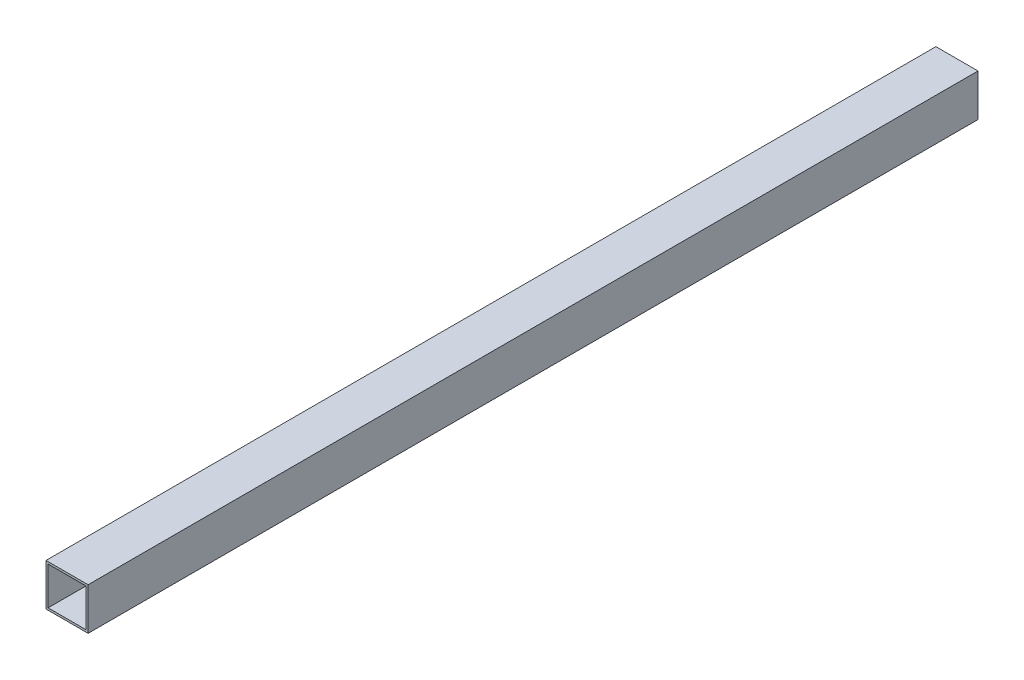
ISO-10303-21;
HEADER;
FILE_DESCRIPTION(('STEP AP214'),'2;1');
FILE_NAME('part.step','',(''),(''),'','','');
FILE_SCHEMA(('AUTOMOTIVE_DESIGN { 1 0 10303 214 1 1 1 1 }'));
ENDSEC;
DATA;
#1=APPLICATION_CONTEXT('core data for automotive mechanical design processes');
#2=APPLICATION_PROTOCOL_DEFINITION('international standard','automotive_design',2000,#1);
#3=PRODUCT_CONTEXT('',#1,'mechanical');
#4=PRODUCT('Part','Part','',(#3));
#5=PRODUCT_RELATED_PRODUCT_CATEGORY('part','',(#4));
#6=PRODUCT_DEFINITION_FORMATION('','',#4);
#7=PRODUCT_DEFINITION_CONTEXT('part definition',#1,'design');
#8=PRODUCT_DEFINITION('design','',#6,#7);
#9=PRODUCT_DEFINITION_SHAPE('','',#8);
#10=(LENGTH_UNIT() NAMED_UNIT(*) SI_UNIT(.MILLI.,.METRE.));
#11=(NAMED_UNIT(*) PLANE_ANGLE_UNIT() SI_UNIT($,.RADIAN.));
#12=(NAMED_UNIT(*) SI_UNIT($,.STERADIAN.) SOLID_ANGLE_UNIT());
#13=UNCERTAINTY_MEASURE_WITH_UNIT(LENGTH_MEASURE(1.E-05),#10,'distance_accuracy_value','');
#14=(GEOMETRIC_REPRESENTATION_CONTEXT(3) GLOBAL_UNCERTAINTY_ASSIGNED_CONTEXT((#13)) GLOBAL_UNIT_ASSIGNED_CONTEXT((#10,
#11,#12)) REPRESENTATION_CONTEXT('',''));
#15=CARTESIAN_POINT('',(0.,0.,0.));
#16=DIRECTION('',(0.,0.,1.));
#17=DIRECTION('',(1.,0.,0.));
#18=AXIS2_PLACEMENT_3D('',#15,#16,#17);
#19=CARTESIAN_POINT('',(0.,0.,422.68));
#20=DIRECTION('',(0.,0.,1.));
#21=DIRECTION('',(1.,0.,0.));
#22=AXIS2_PLACEMENT_3D('',#19,#20,#21);
#23=PLANE('',#22);
#24=DIRECTION('',(0.,-1.,0.));
#25=VECTOR('',#24,1.);
#26=CARTESIAN_POINT('',(0.,0.,422.68));
#27=LINE('',#26,#25);
#28=CARTESIAN_POINT('',(0.,0.,422.68));
#29=VERTEX_POINT('',#28);
#30=CARTESIAN_POINT('',(0.,-20.,422.68));
#31=VERTEX_POINT('',#30);
#32=EDGE_CURVE('E134',#29,#31,#27,.T.);
#33=ORIENTED_EDGE('',*,*,#32,.T.);
#34=DIRECTION('',(1.,0.,0.));
#35=VECTOR('',#34,1.);
#36=CARTESIAN_POINT('',(0.,-20.,422.68));
#37=LINE('',#36,#35);
#38=CARTESIAN_POINT('',(20.,-20.,422.68));
#39=VERTEX_POINT('',#38);
#40=EDGE_CURVE('E137',#31,#39,#37,.T.);
#41=ORIENTED_EDGE('',*,*,#40,.T.);
#42=DIRECTION('',(0.,1.,0.));
#43=VECTOR('',#42,1.);
#44=CARTESIAN_POINT('',(20.,0.,422.68));
#45=LINE('',#44,#43);
#46=CARTESIAN_POINT('',(20.,0.,422.68));
#47=VERTEX_POINT('',#46);
#48=EDGE_CURVE('E140',#39,#47,#45,.T.);
#49=ORIENTED_EDGE('',*,*,#48,.T.);
#50=DIRECTION('',(-1.,0.,0.));
#51=VECTOR('',#50,1.);
#52=CARTESIAN_POINT('',(0.,0.,422.68));
#53=LINE('',#52,#51);
#54=EDGE_CURVE('E142',#47,#29,#53,.T.);
#55=ORIENTED_EDGE('',*,*,#54,.T.);
#56=EDGE_LOOP('',(#33,#41,#49,#55));
#57=FACE_BOUND('',#56,.T.);
#58=DIRECTION('',(-1.,0.,0.));
#59=VECTOR('',#58,1.);
#60=CARTESIAN_POINT('',(1.,-1.,422.68));
#61=LINE('',#60,#59);
#62=CARTESIAN_POINT('',(19.,-1.,422.68));
#63=VERTEX_POINT('',#62);
#64=CARTESIAN_POINT('',(1.,-1.,422.68));
#65=VERTEX_POINT('',#64);
#66=EDGE_CURVE('E106',#63,#65,#61,.T.);
#67=ORIENTED_EDGE('',*,*,#66,.F.);
#68=DIRECTION('',(0.,1.,0.));
#69=VECTOR('',#68,1.);
#70=CARTESIAN_POINT('',(19.,-19.,422.68));
#71=LINE('',#70,#69);
#72=CARTESIAN_POINT('',(19.,-19.,422.68));
#73=VERTEX_POINT('',#72);
#74=EDGE_CURVE('E98',#73,#63,#71,.T.);
#75=ORIENTED_EDGE('',*,*,#74,.F.);
#76=DIRECTION('',(1.,0.,0.));
#77=VECTOR('',#76,1.);
#78=CARTESIAN_POINT('',(1.,-19.,422.68));
#79=LINE('',#78,#77);
#80=CARTESIAN_POINT('',(1.,-19.,422.68));
#81=VERTEX_POINT('',#80);
#82=EDGE_CURVE('E120',#81,#73,#79,.T.);
#83=ORIENTED_EDGE('',*,*,#82,.F.);
#84=DIRECTION('',(0.,-1.,0.));
#85=VECTOR('',#84,1.);
#86=CARTESIAN_POINT('',(1.,-19.,422.68));
#87=LINE('',#86,#85);
#88=EDGE_CURVE('E118',#65,#81,#87,.T.);
#89=ORIENTED_EDGE('',*,*,#88,.F.);
#90=EDGE_LOOP('',(#67,#75,#83,#89));
#91=FACE_BOUND('',#90,.T.);
#92=ADVANCED_FACE('F33',(#57,#91),#23,.T.);
#93=CARTESIAN_POINT('',(0.,0.,0.));
#94=DIRECTION('',(0.,0.,1.));
#95=DIRECTION('',(1.,0.,0.));
#96=AXIS2_PLACEMENT_3D('',#93,#94,#95);
#97=PLANE('',#96);
#98=DIRECTION('',(0.,-1.,0.));
#99=VECTOR('',#98,1.);
#100=CARTESIAN_POINT('',(0.,0.,0.));
#101=LINE('',#100,#99);
#102=CARTESIAN_POINT('',(0.,0.,0.));
#103=VERTEX_POINT('',#102);
#104=CARTESIAN_POINT('',(0.,-20.,0.));
#105=VERTEX_POINT('',#104);
#106=EDGE_CURVE('E114',#103,#105,#101,.T.);
#107=ORIENTED_EDGE('',*,*,#106,.F.);
#108=DIRECTION('',(-1.,0.,0.));
#109=VECTOR('',#108,1.);
#110=CARTESIAN_POINT('',(0.,0.,0.));
#111=LINE('',#110,#109);
#112=CARTESIAN_POINT('',(20.,0.,0.));
#113=VERTEX_POINT('',#112);
#114=EDGE_CURVE('E138',#113,#103,#111,.T.);
#115=ORIENTED_EDGE('',*,*,#114,.F.);
#116=DIRECTION('',(0.,1.,0.));
#117=VECTOR('',#116,1.);
#118=CARTESIAN_POINT('',(20.,0.,0.));
#119=LINE('',#118,#117);
#120=CARTESIAN_POINT('',(20.,-20.,0.));
#121=VERTEX_POINT('',#120);
#122=EDGE_CURVE('E149',#121,#113,#119,.T.);
#123=ORIENTED_EDGE('',*,*,#122,.F.);
#124=DIRECTION('',(1.,0.,0.));
#125=VECTOR('',#124,1.);
#126=CARTESIAN_POINT('',(0.,-20.,0.));
#127=LINE('',#126,#125);
#128=EDGE_CURVE('E147',#105,#121,#127,.T.);
#129=ORIENTED_EDGE('',*,*,#128,.F.);
#130=EDGE_LOOP('',(#107,#115,#123,#129));
#131=FACE_BOUND('',#130,.T.);
#132=DIRECTION('',(0.,1.,0.));
#133=VECTOR('',#132,1.);
#134=CARTESIAN_POINT('',(19.,-19.,0.));
#135=LINE('',#134,#133);
#136=CARTESIAN_POINT('',(19.,-19.,0.));
#137=VERTEX_POINT('',#136);
#138=CARTESIAN_POINT('',(19.,-1.,0.));
#139=VERTEX_POINT('',#138);
#140=EDGE_CURVE('E56',#137,#139,#135,.T.);
#141=ORIENTED_EDGE('',*,*,#140,.T.);
#142=DIRECTION('',(-1.,0.,0.));
#143=VECTOR('',#142,1.);
#144=CARTESIAN_POINT('',(1.,-1.,0.));
#145=LINE('',#144,#143);
#146=CARTESIAN_POINT('',(1.,-1.,0.));
#147=VERTEX_POINT('',#146);
#148=EDGE_CURVE('E113',#139,#147,#145,.T.);
#149=ORIENTED_EDGE('',*,*,#148,.T.);
#150=DIRECTION('',(0.,-1.,0.));
#151=VECTOR('',#150,1.);
#152=CARTESIAN_POINT('',(1.,-19.,0.));
#153=LINE('',#152,#151);
#154=CARTESIAN_POINT('',(1.,-19.,0.));
#155=VERTEX_POINT('',#154);
#156=EDGE_CURVE('E126',#147,#155,#153,.T.);
#157=ORIENTED_EDGE('',*,*,#156,.T.);
#158=DIRECTION('',(1.,0.,0.));
#159=VECTOR('',#158,1.);
#160=CARTESIAN_POINT('',(1.,-19.,0.));
#161=LINE('',#160,#159);
#162=EDGE_CURVE('E107',#155,#137,#161,.T.);
#163=ORIENTED_EDGE('',*,*,#162,.T.);
#164=EDGE_LOOP('',(#141,#149,#157,#163));
#165=FACE_BOUND('',#164,.T.);
#166=ADVANCED_FACE('F167',(#131,#165),#97,.F.);
#167=CARTESIAN_POINT('',(0.,0.,422.68));
#168=DIRECTION('',(1.,0.,0.));
#169=DIRECTION('',(0.,0.,-1.));
#170=AXIS2_PLACEMENT_3D('',#167,#168,#169);
#171=PLANE('',#170);
#172=ORIENTED_EDGE('',*,*,#106,.T.);
#173=DIRECTION('',(0.,0.,-1.));
#174=VECTOR('',#173,1.);
#175=CARTESIAN_POINT('',(0.,-20.,422.68));
#176=LINE('',#175,#174);
#177=EDGE_CURVE('E11',#31,#105,#176,.T.);
#178=ORIENTED_EDGE('',*,*,#177,.F.);
#179=ORIENTED_EDGE('',*,*,#32,.F.);
#180=DIRECTION('',(0.,0.,-1.));
#181=VECTOR('',#180,1.);
#182=CARTESIAN_POINT('',(0.,0.,422.68));
#183=LINE('',#182,#181);
#184=EDGE_CURVE('E144',#29,#103,#183,.T.);
#185=ORIENTED_EDGE('',*,*,#184,.T.);
#186=EDGE_LOOP('',(#172,#178,#179,#185));
#187=FACE_BOUND('',#186,.T.);
#188=ADVANCED_FACE('F35',(#187),#171,.F.);
#189=CARTESIAN_POINT('',(0.,-20.,422.68));
#190=DIRECTION('',(0.,1.,0.));
#191=DIRECTION('',(0.,0.,1.));
#192=AXIS2_PLACEMENT_3D('',#189,#190,#191);
#193=PLANE('',#192);
#194=ORIENTED_EDGE('',*,*,#128,.T.);
#195=DIRECTION('',(0.,0.,-1.));
#196=VECTOR('',#195,1.);
#197=CARTESIAN_POINT('',(20.,-20.,422.68));
#198=LINE('',#197,#196);
#199=EDGE_CURVE('E41',#39,#121,#198,.T.);
#200=ORIENTED_EDGE('',*,*,#199,.F.);
#201=ORIENTED_EDGE('',*,*,#40,.F.);
#202=ORIENTED_EDGE('',*,*,#177,.T.);
#203=EDGE_LOOP('',(#194,#200,#201,#202));
#204=FACE_BOUND('',#203,.T.);
#205=ADVANCED_FACE('F177',(#204),#193,.F.);
#206=CARTESIAN_POINT('',(20.,0.,422.68));
#207=DIRECTION('',(-1.,0.,0.));
#208=DIRECTION('',(0.,-1.,0.));
#209=AXIS2_PLACEMENT_3D('',#206,#207,#208);
#210=PLANE('',#209);
#211=ORIENTED_EDGE('',*,*,#122,.T.);
#212=DIRECTION('',(0.,0.,-1.));
#213=VECTOR('',#212,1.);
#214=CARTESIAN_POINT('',(20.,0.,422.68));
#215=LINE('',#214,#213);
#216=EDGE_CURVE('E154',#47,#113,#215,.T.);
#217=ORIENTED_EDGE('',*,*,#216,.F.);
#218=ORIENTED_EDGE('',*,*,#48,.F.);
#219=ORIENTED_EDGE('',*,*,#199,.T.);
#220=EDGE_LOOP('',(#211,#217,#218,#219));
#221=FACE_BOUND('',#220,.T.);
#222=ADVANCED_FACE('F161',(#221),#210,.F.);
#223=CARTESIAN_POINT('',(0.,0.,422.68));
#224=DIRECTION('',(0.,-1.,0.));
#225=DIRECTION('',(0.,0.,-1.));
#226=AXIS2_PLACEMENT_3D('',#223,#224,#225);
#227=PLANE('',#226);
#228=ORIENTED_EDGE('',*,*,#114,.T.);
#229=ORIENTED_EDGE('',*,*,#184,.F.);
#230=ORIENTED_EDGE('',*,*,#54,.F.);
#231=ORIENTED_EDGE('',*,*,#216,.T.);
#232=EDGE_LOOP('',(#228,#229,#230,#231));
#233=FACE_BOUND('',#232,.T.);
#234=ADVANCED_FACE('F171',(#233),#227,.F.);
#235=CARTESIAN_POINT('',(19.,-19.,422.68));
#236=DIRECTION('',(-1.,0.,0.));
#237=DIRECTION('',(0.,0.,1.));
#238=AXIS2_PLACEMENT_3D('',#235,#236,#237);
#239=PLANE('',#238);
#240=ORIENTED_EDGE('',*,*,#140,.F.);
#241=DIRECTION('',(0.,0.,-1.));
#242=VECTOR('',#241,1.);
#243=CARTESIAN_POINT('',(19.,-19.,422.68));
#244=LINE('',#243,#242);
#245=EDGE_CURVE('E102',#73,#137,#244,.T.);
#246=ORIENTED_EDGE('',*,*,#245,.F.);
#247=ORIENTED_EDGE('',*,*,#74,.T.);
#248=DIRECTION('',(0.,0.,-1.));
#249=VECTOR('',#248,1.);
#250=CARTESIAN_POINT('',(19.,-1.,422.68));
#251=LINE('',#250,#249);
#252=EDGE_CURVE('E101',#63,#139,#251,.T.);
#253=ORIENTED_EDGE('',*,*,#252,.T.);
#254=EDGE_LOOP('',(#240,#246,#247,#253));
#255=FACE_BOUND('',#254,.T.);
#256=ADVANCED_FACE('F100',(#255),#239,.T.);
#257=CARTESIAN_POINT('',(1.,-1.,422.68));
#258=DIRECTION('',(0.,-1.,0.));
#259=DIRECTION('',(0.,0.,-1.));
#260=AXIS2_PLACEMENT_3D('',#257,#258,#259);
#261=PLANE('',#260);
#262=ORIENTED_EDGE('',*,*,#148,.F.);
#263=ORIENTED_EDGE('',*,*,#252,.F.);
#264=ORIENTED_EDGE('',*,*,#66,.T.);
#265=DIRECTION('',(0.,0.,-1.));
#266=VECTOR('',#265,1.);
#267=CARTESIAN_POINT('',(1.,-1.,422.68));
#268=LINE('',#267,#266);
#269=EDGE_CURVE('E115',#65,#147,#268,.T.);
#270=ORIENTED_EDGE('',*,*,#269,.T.);
#271=EDGE_LOOP('',(#262,#263,#264,#270));
#272=FACE_BOUND('',#271,.T.);
#273=ADVANCED_FACE('F110',(#272),#261,.T.);
#274=CARTESIAN_POINT('',(1.,-19.,422.68));
#275=DIRECTION('',(1.,0.,0.));
#276=DIRECTION('',(0.,0.,-1.));
#277=AXIS2_PLACEMENT_3D('',#274,#275,#276);
#278=PLANE('',#277);
#279=ORIENTED_EDGE('',*,*,#156,.F.);
#280=ORIENTED_EDGE('',*,*,#269,.F.);
#281=ORIENTED_EDGE('',*,*,#88,.T.);
#282=DIRECTION('',(0.,0.,-1.));
#283=VECTOR('',#282,1.);
#284=CARTESIAN_POINT('',(1.,-19.,422.68));
#285=LINE('',#284,#283);
#286=EDGE_CURVE('E48',#81,#155,#285,.T.);
#287=ORIENTED_EDGE('',*,*,#286,.T.);
#288=EDGE_LOOP('',(#279,#280,#281,#287));
#289=FACE_BOUND('',#288,.T.);
#290=ADVANCED_FACE('F200',(#289),#278,.T.);
#291=CARTESIAN_POINT('',(1.,-19.,422.68));
#292=DIRECTION('',(0.,1.,0.));
#293=DIRECTION('',(0.,0.,1.));
#294=AXIS2_PLACEMENT_3D('',#291,#292,#293);
#295=PLANE('',#294);
#296=ORIENTED_EDGE('',*,*,#162,.F.);
#297=ORIENTED_EDGE('',*,*,#286,.F.);
#298=ORIENTED_EDGE('',*,*,#82,.T.);
#299=ORIENTED_EDGE('',*,*,#245,.T.);
#300=EDGE_LOOP('',(#296,#297,#298,#299));
#301=FACE_BOUND('',#300,.T.);
#302=ADVANCED_FACE('F204',(#301),#295,.T.);
#303=CLOSED_SHELL('',(#92,#166,#188,#205,#222,#234,#256,#273,#290,#302));
#304=MANIFOLD_SOLID_BREP('B2',#303);
#305=ADVANCED_BREP_SHAPE_REPRESENTATION('',(#18,#304),#14);
#306=SHAPE_DEFINITION_REPRESENTATION(#9,#305);
ENDSEC;
END-ISO-10303-21;
